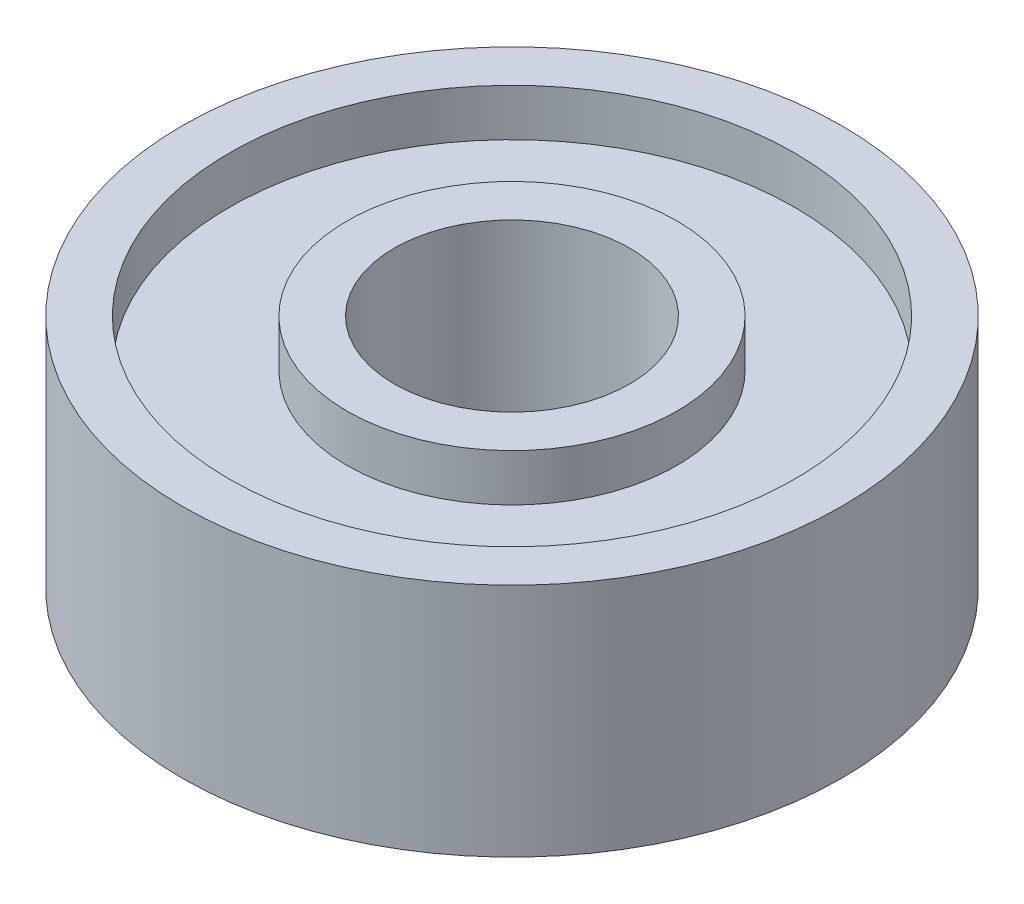
ISO-10303-21;
HEADER;
FILE_DESCRIPTION(('STEP AP214'),'2;1');
FILE_NAME('part.step','',(''),(''),'','','');
FILE_SCHEMA(('AUTOMOTIVE_DESIGN { 1 0 10303 214 1 1 1 1 }'));
ENDSEC;
DATA;
#1=APPLICATION_CONTEXT('core data for automotive mechanical design processes');
#2=APPLICATION_PROTOCOL_DEFINITION('international standard','automotive_design',2000,#1);
#3=PRODUCT_CONTEXT('',#1,'mechanical');
#4=PRODUCT('Part','Part','',(#3));
#5=PRODUCT_RELATED_PRODUCT_CATEGORY('part','',(#4));
#6=PRODUCT_DEFINITION_FORMATION('','',#4);
#7=PRODUCT_DEFINITION_CONTEXT('part definition',#1,'design');
#8=PRODUCT_DEFINITION('design','',#6,#7);
#9=PRODUCT_DEFINITION_SHAPE('','',#8);
#10=(LENGTH_UNIT() NAMED_UNIT(*) SI_UNIT(.MILLI.,.METRE.));
#11=(NAMED_UNIT(*) PLANE_ANGLE_UNIT() SI_UNIT($,.RADIAN.));
#12=(NAMED_UNIT(*) SI_UNIT($,.STERADIAN.) SOLID_ANGLE_UNIT());
#13=UNCERTAINTY_MEASURE_WITH_UNIT(LENGTH_MEASURE(1.E-05),#10,'distance_accuracy_value','');
#14=(GEOMETRIC_REPRESENTATION_CONTEXT(3) GLOBAL_UNCERTAINTY_ASSIGNED_CONTEXT((#13)) GLOBAL_UNIT_ASSIGNED_CONTEXT((#10,
#11,#12)) REPRESENTATION_CONTEXT('',''));
#15=CARTESIAN_POINT('',(0.,0.,0.));
#16=DIRECTION('',(0.,0.,1.));
#17=DIRECTION('',(1.,0.,0.));
#18=AXIS2_PLACEMENT_3D('',#15,#16,#17);
#19=CARTESIAN_POINT('',(0.,0.,0.));
#20=DIRECTION('',(0.,1.,0.));
#21=DIRECTION('',(0.,0.,1.));
#22=AXIS2_PLACEMENT_3D('',#19,#20,#21);
#23=PLANE('',#22);
#24=CARTESIAN_POINT('',(0.,0.,0.));
#25=DIRECTION('',(0.,1.,0.));
#26=DIRECTION('',(0.,0.,1.));
#27=AXIS2_PLACEMENT_3D('',#24,#25,#26);
#28=CIRCLE('',#27,2.5);
#29=CARTESIAN_POINT('',(0.,0.,2.5));
#30=VERTEX_POINT('',#29);
#31=EDGE_CURVE('E44',#30,#30,#28,.T.);
#32=ORIENTED_EDGE('',*,*,#31,.T.);
#33=EDGE_LOOP('',(#32));
#34=FACE_BOUND('',#33,.T.);
#35=CARTESIAN_POINT('',(0.,0.,0.));
#36=DIRECTION('',(0.,-1.,0.));
#37=DIRECTION('',(0.,0.,-1.));
#38=AXIS2_PLACEMENT_3D('',#35,#36,#37);
#39=CIRCLE('',#38,3.5);
#40=CARTESIAN_POINT('',(0.,0.,-3.5));
#41=VERTEX_POINT('',#40);
#42=EDGE_CURVE('E68',#41,#41,#39,.T.);
#43=ORIENTED_EDGE('',*,*,#42,.T.);
#44=EDGE_LOOP('',(#43));
#45=FACE_BOUND('',#44,.T.);
#46=ADVANCED_FACE('F31',(#34,#45),#23,.F.);
#47=CARTESIAN_POINT('',(0.,5.,0.));
#48=DIRECTION('',(0.,1.,0.));
#49=DIRECTION('',(0.,0.,1.));
#50=AXIS2_PLACEMENT_3D('',#47,#48,#49);
#51=PLANE('',#50);
#52=CARTESIAN_POINT('',(0.,5.,0.));
#53=DIRECTION('',(0.,1.,0.));
#54=DIRECTION('',(0.,0.,1.));
#55=AXIS2_PLACEMENT_3D('',#52,#53,#54);
#56=CIRCLE('',#55,2.5);
#57=CARTESIAN_POINT('',(0.,5.,2.5));
#58=VERTEX_POINT('',#57);
#59=EDGE_CURVE('E42',#58,#58,#56,.T.);
#60=ORIENTED_EDGE('',*,*,#59,.F.);
#61=EDGE_LOOP('',(#60));
#62=FACE_BOUND('',#61,.T.);
#63=CARTESIAN_POINT('',(0.,5.,0.));
#64=DIRECTION('',(0.,1.,0.));
#65=DIRECTION('',(0.,0.,1.));
#66=AXIS2_PLACEMENT_3D('',#63,#64,#65);
#67=CIRCLE('',#66,3.5);
#68=CARTESIAN_POINT('',(0.,5.,3.5));
#69=VERTEX_POINT('',#68);
#70=EDGE_CURVE('E56',#69,#69,#67,.T.);
#71=ORIENTED_EDGE('',*,*,#70,.T.);
#72=EDGE_LOOP('',(#71));
#73=FACE_BOUND('',#72,.T.);
#74=ADVANCED_FACE('F106',(#62,#73),#51,.T.);
#75=CARTESIAN_POINT('',(0.,5.,0.));
#76=DIRECTION('',(0.,1.,0.));
#77=DIRECTION('',(0.,0.,1.));
#78=AXIS2_PLACEMENT_3D('',#75,#76,#77);
#79=CIRCLE('',#78,6.);
#80=CARTESIAN_POINT('',(0.,5.,6.));
#81=VERTEX_POINT('',#80);
#82=EDGE_CURVE('E50',#81,#81,#79,.T.);
#83=ORIENTED_EDGE('',*,*,#82,.F.);
#84=EDGE_LOOP('',(#83));
#85=FACE_BOUND('',#84,.T.);
#86=CARTESIAN_POINT('',(0.,5.,0.));
#87=DIRECTION('',(0.,1.,0.));
#88=DIRECTION('',(0.,0.,1.));
#89=AXIS2_PLACEMENT_3D('',#86,#87,#88);
#90=CIRCLE('',#89,7.);
#91=CARTESIAN_POINT('',(0.,5.,7.));
#92=VERTEX_POINT('',#91);
#93=EDGE_CURVE('E10',#92,#92,#90,.T.);
#94=ORIENTED_EDGE('',*,*,#93,.T.);
#95=EDGE_LOOP('',(#94));
#96=FACE_BOUND('',#95,.T.);
#97=ADVANCED_FACE('F93',(#85,#96),#51,.T.);
#98=CARTESIAN_POINT('',(0.,0.,0.));
#99=DIRECTION('',(0.,-1.,0.));
#100=DIRECTION('',(0.,0.,-1.));
#101=AXIS2_PLACEMENT_3D('',#98,#99,#100);
#102=CIRCLE('',#101,6.);
#103=CARTESIAN_POINT('',(0.,0.,-6.));
#104=VERTEX_POINT('',#103);
#105=EDGE_CURVE('E62',#104,#104,#102,.T.);
#106=ORIENTED_EDGE('',*,*,#105,.F.);
#107=EDGE_LOOP('',(#106));
#108=FACE_BOUND('',#107,.T.);
#109=CARTESIAN_POINT('',(0.,0.,0.));
#110=DIRECTION('',(0.,1.,0.));
#111=DIRECTION('',(0.,0.,1.));
#112=AXIS2_PLACEMENT_3D('',#109,#110,#111);
#113=CIRCLE('',#112,7.);
#114=CARTESIAN_POINT('',(0.,0.,7.));
#115=VERTEX_POINT('',#114);
#116=EDGE_CURVE('E35',#115,#115,#113,.T.);
#117=ORIENTED_EDGE('',*,*,#116,.F.);
#118=EDGE_LOOP('',(#117));
#119=FACE_BOUND('',#118,.T.);
#120=ADVANCED_FACE('F90',(#108,#119),#23,.F.);
#121=CARTESIAN_POINT('',(0.,5.,0.));
#122=DIRECTION('',(0.,-1.,0.));
#123=DIRECTION('',(0.,0.,-1.));
#124=AXIS2_PLACEMENT_3D('',#121,#122,#123);
#125=CYLINDRICAL_SURFACE('',#124,7.);
#126=ORIENTED_EDGE('',*,*,#93,.F.);
#127=EDGE_LOOP('',(#126));
#128=FACE_BOUND('',#127,.T.);
#129=ORIENTED_EDGE('',*,*,#116,.T.);
#130=EDGE_LOOP('',(#129));
#131=FACE_BOUND('',#130,.T.);
#132=ADVANCED_FACE('F33',(#128,#131),#125,.T.);
#133=CARTESIAN_POINT('',(0.,5.,0.));
#134=DIRECTION('',(0.,-1.,0.));
#135=DIRECTION('',(0.,0.,-1.));
#136=AXIS2_PLACEMENT_3D('',#133,#134,#135);
#137=CYLINDRICAL_SURFACE('',#136,2.5);
#138=ORIENTED_EDGE('',*,*,#59,.T.);
#139=EDGE_LOOP('',(#138));
#140=FACE_BOUND('',#139,.T.);
#141=ORIENTED_EDGE('',*,*,#31,.F.);
#142=EDGE_LOOP('',(#141));
#143=FACE_BOUND('',#142,.T.);
#144=ADVANCED_FACE('F97',(#140,#143),#137,.F.);
#145=CARTESIAN_POINT('',(0.,4.,0.));
#146=DIRECTION('',(0.,1.,0.));
#147=DIRECTION('',(0.,0.,1.));
#148=AXIS2_PLACEMENT_3D('',#145,#146,#147);
#149=CYLINDRICAL_SURFACE('',#148,6.);
#150=CARTESIAN_POINT('',(0.,4.,0.));
#151=DIRECTION('',(0.,1.,0.));
#152=DIRECTION('',(0.,0.,1.));
#153=AXIS2_PLACEMENT_3D('',#150,#151,#152);
#154=CIRCLE('',#153,6.);
#155=CARTESIAN_POINT('',(0.,4.,6.));
#156=VERTEX_POINT('',#155);
#157=EDGE_CURVE('E47',#156,#156,#154,.T.);
#158=ORIENTED_EDGE('',*,*,#157,.F.);
#159=EDGE_LOOP('',(#158));
#160=FACE_BOUND('',#159,.T.);
#161=ORIENTED_EDGE('',*,*,#82,.T.);
#162=EDGE_LOOP('',(#161));
#163=FACE_BOUND('',#162,.T.);
#164=ADVANCED_FACE('F102',(#160,#163),#149,.F.);
#165=CARTESIAN_POINT('',(0.,4.,0.));
#166=DIRECTION('',(0.,1.,0.));
#167=DIRECTION('',(0.,0.,1.));
#168=AXIS2_PLACEMENT_3D('',#165,#166,#167);
#169=PLANE('',#168);
#170=CARTESIAN_POINT('',(0.,4.,0.));
#171=DIRECTION('',(0.,1.,0.));
#172=DIRECTION('',(0.,0.,1.));
#173=AXIS2_PLACEMENT_3D('',#170,#171,#172);
#174=CIRCLE('',#173,3.5);
#175=CARTESIAN_POINT('',(0.,4.,3.5));
#176=VERTEX_POINT('',#175);
#177=EDGE_CURVE('E53',#176,#176,#174,.T.);
#178=ORIENTED_EDGE('',*,*,#177,.F.);
#179=EDGE_LOOP('',(#178));
#180=FACE_BOUND('',#179,.T.);
#181=ORIENTED_EDGE('',*,*,#157,.T.);
#182=EDGE_LOOP('',(#181));
#183=FACE_BOUND('',#182,.T.);
#184=ADVANCED_FACE('F119',(#180,#183),#169,.T.);
#185=CARTESIAN_POINT('',(0.,4.,0.));
#186=DIRECTION('',(0.,1.,0.));
#187=DIRECTION('',(0.,0.,1.));
#188=AXIS2_PLACEMENT_3D('',#185,#186,#187);
#189=CYLINDRICAL_SURFACE('',#188,3.5);
#190=ORIENTED_EDGE('',*,*,#177,.T.);
#191=EDGE_LOOP('',(#190));
#192=FACE_BOUND('',#191,.T.);
#193=ORIENTED_EDGE('',*,*,#70,.F.);
#194=EDGE_LOOP('',(#193));
#195=FACE_BOUND('',#194,.T.);
#196=ADVANCED_FACE('F86',(#192,#195),#189,.T.);
#197=CARTESIAN_POINT('',(0.,1.,0.));
#198=DIRECTION('',(0.,-1.,0.));
#199=DIRECTION('',(0.,0.,-1.));
#200=AXIS2_PLACEMENT_3D('',#197,#198,#199);
#201=CYLINDRICAL_SURFACE('',#200,6.);
#202=CARTESIAN_POINT('',(0.,1.,0.));
#203=DIRECTION('',(0.,-1.,0.));
#204=DIRECTION('',(0.,0.,-1.));
#205=AXIS2_PLACEMENT_3D('',#202,#203,#204);
#206=CIRCLE('',#205,6.);
#207=CARTESIAN_POINT('',(0.,1.,-6.));
#208=VERTEX_POINT('',#207);
#209=EDGE_CURVE('E59',#208,#208,#206,.T.);
#210=ORIENTED_EDGE('',*,*,#209,.F.);
#211=EDGE_LOOP('',(#210));
#212=FACE_BOUND('',#211,.T.);
#213=ORIENTED_EDGE('',*,*,#105,.T.);
#214=EDGE_LOOP('',(#213));
#215=FACE_BOUND('',#214,.T.);
#216=ADVANCED_FACE('F80',(#212,#215),#201,.F.);
#217=CARTESIAN_POINT('',(0.,1.,0.));
#218=DIRECTION('',(0.,-1.,0.));
#219=DIRECTION('',(0.,0.,-1.));
#220=AXIS2_PLACEMENT_3D('',#217,#218,#219);
#221=PLANE('',#220);
#222=CARTESIAN_POINT('',(0.,1.,0.));
#223=DIRECTION('',(0.,-1.,0.));
#224=DIRECTION('',(0.,0.,-1.));
#225=AXIS2_PLACEMENT_3D('',#222,#223,#224);
#226=CIRCLE('',#225,3.5);
#227=CARTESIAN_POINT('',(0.,1.,-3.5));
#228=VERTEX_POINT('',#227);
#229=EDGE_CURVE('E65',#228,#228,#226,.T.);
#230=ORIENTED_EDGE('',*,*,#229,.F.);
#231=EDGE_LOOP('',(#230));
#232=FACE_BOUND('',#231,.T.);
#233=ORIENTED_EDGE('',*,*,#209,.T.);
#234=EDGE_LOOP('',(#233));
#235=FACE_BOUND('',#234,.T.);
#236=ADVANCED_FACE('F77',(#232,#235),#221,.T.);
#237=CARTESIAN_POINT('',(0.,1.,0.));
#238=DIRECTION('',(0.,-1.,0.));
#239=DIRECTION('',(0.,0.,-1.));
#240=AXIS2_PLACEMENT_3D('',#237,#238,#239);
#241=CYLINDRICAL_SURFACE('',#240,3.5);
#242=ORIENTED_EDGE('',*,*,#229,.T.);
#243=EDGE_LOOP('',(#242));
#244=FACE_BOUND('',#243,.T.);
#245=ORIENTED_EDGE('',*,*,#42,.F.);
#246=EDGE_LOOP('',(#245));
#247=FACE_BOUND('',#246,.T.);
#248=ADVANCED_FACE('F74',(#244,#247),#241,.T.);
#249=CLOSED_SHELL('',(#46,#74,#97,#120,#132,#144,#164,#184,#196,#216,#236,#248));
#250=MANIFOLD_SOLID_BREP('B2',#249);
#251=ADVANCED_BREP_SHAPE_REPRESENTATION('',(#18,#250),#14);
#252=SHAPE_DEFINITION_REPRESENTATION(#9,#251);
ENDSEC;
END-ISO-10303-21;
